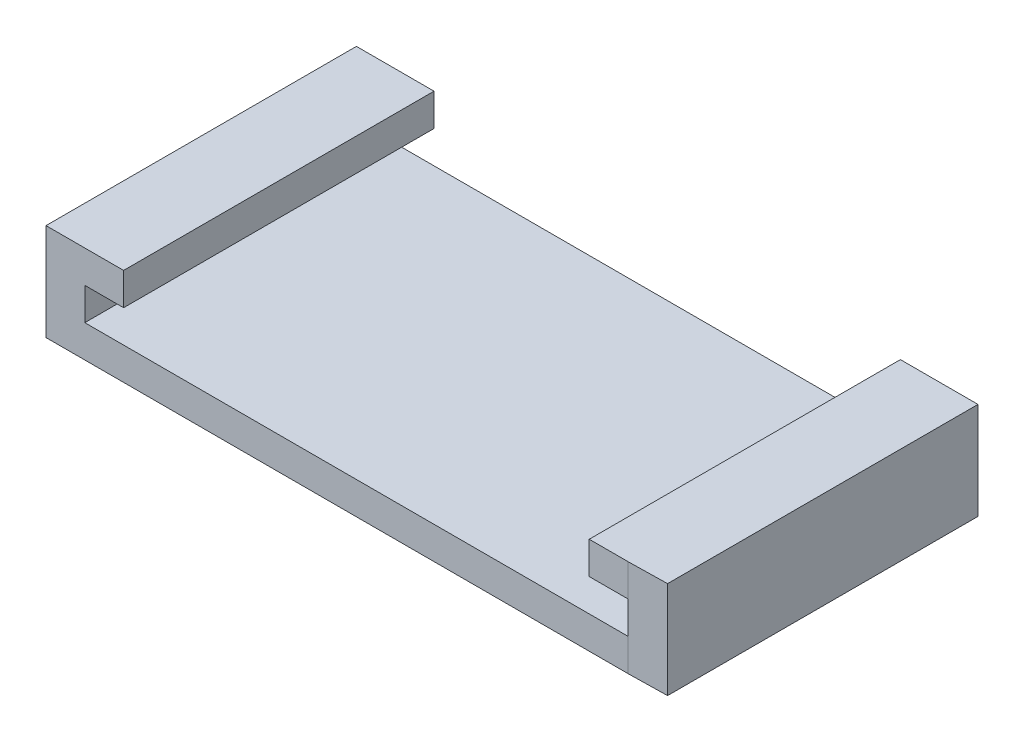
ISO-10303-21;
HEADER;
FILE_DESCRIPTION(('STEP AP214'),'2;1');
FILE_NAME('part.step','',(''),(''),'','','');
FILE_SCHEMA(('AUTOMOTIVE_DESIGN { 1 0 10303 214 1 1 1 1 }'));
ENDSEC;
DATA;
#1=APPLICATION_CONTEXT('core data for automotive mechanical design processes');
#2=APPLICATION_PROTOCOL_DEFINITION('international standard','automotive_design',2000,#1);
#3=PRODUCT_CONTEXT('',#1,'mechanical');
#4=PRODUCT('Part','Part','',(#3));
#5=PRODUCT_RELATED_PRODUCT_CATEGORY('part','',(#4));
#6=PRODUCT_DEFINITION_FORMATION('','',#4);
#7=PRODUCT_DEFINITION_CONTEXT('part definition',#1,'design');
#8=PRODUCT_DEFINITION('design','',#6,#7);
#9=PRODUCT_DEFINITION_SHAPE('','',#8);
#10=(LENGTH_UNIT() NAMED_UNIT(*) SI_UNIT(.MILLI.,.METRE.));
#11=(NAMED_UNIT(*) PLANE_ANGLE_UNIT() SI_UNIT($,.RADIAN.));
#12=(NAMED_UNIT(*) SI_UNIT($,.STERADIAN.) SOLID_ANGLE_UNIT());
#13=UNCERTAINTY_MEASURE_WITH_UNIT(LENGTH_MEASURE(1.E-05),#10,'distance_accuracy_value','');
#14=(GEOMETRIC_REPRESENTATION_CONTEXT(3) GLOBAL_UNCERTAINTY_ASSIGNED_CONTEXT((#13)) GLOBAL_UNIT_ASSIGNED_CONTEXT((#10,
#11,#12)) REPRESENTATION_CONTEXT('',''));
#15=CARTESIAN_POINT('',(0.,0.,0.));
#16=DIRECTION('',(0.,0.,1.));
#17=DIRECTION('',(1.,0.,0.));
#18=AXIS2_PLACEMENT_3D('',#15,#16,#17);
#19=CARTESIAN_POINT('',(0.,7.5,0.));
#20=DIRECTION('',(1.,0.,0.));
#21=DIRECTION('',(0.,0.,-1.));
#22=AXIS2_PLACEMENT_3D('',#19,#20,#21);
#23=PLANE('',#22);
#24=DIRECTION('',(0.,-1.,0.));
#25=VECTOR('',#24,1.);
#26=CARTESIAN_POINT('',(0.,7.5,-24.));
#27=LINE('',#26,#25);
#28=CARTESIAN_POINT('',(0.,5.,-24.));
#29=VERTEX_POINT('',#28);
#30=CARTESIAN_POINT('',(0.,2.5,-24.));
#31=VERTEX_POINT('',#30);
#32=EDGE_CURVE('E47',#29,#31,#27,.T.);
#33=ORIENTED_EDGE('',*,*,#32,.F.);
#34=DIRECTION('',(0.,0.,-1.));
#35=VECTOR('',#34,1.);
#36=CARTESIAN_POINT('',(0.,5.,0.));
#37=LINE('',#36,#35);
#38=CARTESIAN_POINT('',(0.,5.,0.));
#39=VERTEX_POINT('',#38);
#40=EDGE_CURVE('E51',#39,#29,#37,.T.);
#41=ORIENTED_EDGE('',*,*,#40,.F.);
#42=DIRECTION('',(0.,-1.,0.));
#43=VECTOR('',#42,1.);
#44=CARTESIAN_POINT('',(0.,7.5,0.));
#45=LINE('',#44,#43);
#46=CARTESIAN_POINT('',(0.,2.5,0.));
#47=VERTEX_POINT('',#46);
#48=EDGE_CURVE('E219',#39,#47,#45,.T.);
#49=ORIENTED_EDGE('',*,*,#48,.T.);
#50=DIRECTION('',(0.,0.,-1.));
#51=VECTOR('',#50,1.);
#52=CARTESIAN_POINT('',(0.,2.5,0.));
#53=LINE('',#52,#51);
#54=EDGE_CURVE('E240',#47,#31,#53,.T.);
#55=ORIENTED_EDGE('',*,*,#54,.T.);
#56=EDGE_LOOP('',(#33,#41,#49,#55));
#57=FACE_BOUND('',#56,.T.);
#58=ADVANCED_FACE('F32',(#57),#23,.T.);
#59=CARTESIAN_POINT('',(42.,7.5,0.));
#60=DIRECTION('',(-1.,0.,0.));
#61=DIRECTION('',(0.,0.,1.));
#62=AXIS2_PLACEMENT_3D('',#59,#60,#61);
#63=PLANE('',#62);
#64=DIRECTION('',(0.,-1.,0.));
#65=VECTOR('',#64,1.);
#66=CARTESIAN_POINT('',(42.,7.5,0.));
#67=LINE('',#66,#65);
#68=CARTESIAN_POINT('',(42.,5.,0.));
#69=VERTEX_POINT('',#68);
#70=CARTESIAN_POINT('',(42.,2.5,0.));
#71=VERTEX_POINT('',#70);
#72=EDGE_CURVE('E210',#69,#71,#67,.T.);
#73=ORIENTED_EDGE('',*,*,#72,.F.);
#74=DIRECTION('',(0.,0.00155997809462607,0.999998783233432));
#75=VECTOR('',#74,1.);
#76=CARTESIAN_POINT('',(42.,4.96247278638862,-24.0562146858351));
#77=LINE('',#76,#75);
#78=CARTESIAN_POINT('',(42.,4.96247278638862,-24.0562146858351));
#79=VERTEX_POINT('',#78);
#80=EDGE_CURVE('E165',#79,#69,#77,.T.);
#81=ORIENTED_EDGE('',*,*,#80,.F.);
#82=DIRECTION('',(0.,-1.,0.));
#83=VECTOR('',#82,1.);
#84=CARTESIAN_POINT('',(42.,7.5,-24.0562146858351));
#85=LINE('',#84,#83);
#86=CARTESIAN_POINT('',(42.,0.,-24.0562146858351));
#87=VERTEX_POINT('',#86);
#88=EDGE_CURVE('E196',#79,#87,#85,.T.);
#89=ORIENTED_EDGE('',*,*,#88,.T.);
#90=DIRECTION('',(0.,0.,-1.));
#91=VECTOR('',#90,1.);
#92=CARTESIAN_POINT('',(42.,0.,0.));
#93=LINE('',#92,#91);
#94=CARTESIAN_POINT('',(42.,0.,-24.));
#95=VERTEX_POINT('',#94);
#96=EDGE_CURVE('E186',#95,#87,#93,.T.);
#97=ORIENTED_EDGE('',*,*,#96,.F.);
#98=DIRECTION('',(0.,-1.,0.));
#99=VECTOR('',#98,1.);
#100=CARTESIAN_POINT('',(42.,2.5,-24.));
#101=LINE('',#100,#99);
#102=CARTESIAN_POINT('',(42.,2.5,-24.));
#103=VERTEX_POINT('',#102);
#104=EDGE_CURVE('E40',#103,#95,#101,.T.);
#105=ORIENTED_EDGE('',*,*,#104,.F.);
#106=DIRECTION('',(0.,0.,-1.));
#107=VECTOR('',#106,1.);
#108=CARTESIAN_POINT('',(42.,2.5,0.));
#109=LINE('',#108,#107);
#110=EDGE_CURVE('E233',#71,#103,#109,.T.);
#111=ORIENTED_EDGE('',*,*,#110,.F.);
#112=EDGE_LOOP('',(#73,#81,#89,#97,#105,#111));
#113=FACE_BOUND('',#112,.T.);
#114=ADVANCED_FACE('F271',(#113),#63,.T.);
#115=CARTESIAN_POINT('',(0.,2.5,0.));
#116=DIRECTION('',(0.,0.,-1.));
#117=DIRECTION('',(-1.,0.,0.));
#118=AXIS2_PLACEMENT_3D('',#115,#116,#117);
#119=PLANE('',#118);
#120=DIRECTION('',(1.,0.,0.));
#121=VECTOR('',#120,1.);
#122=CARTESIAN_POINT('',(0.,0.,0.));
#123=LINE('',#122,#121);
#124=CARTESIAN_POINT('',(-3.,0.,0.));
#125=VERTEX_POINT('',#124);
#126=CARTESIAN_POINT('',(42.,0.,0.));
#127=VERTEX_POINT('',#126);
#128=EDGE_CURVE('E223',#125,#127,#123,.T.);
#129=ORIENTED_EDGE('',*,*,#128,.T.);
#130=DIRECTION('',(0.,-1.,0.));
#131=VECTOR('',#130,1.);
#132=CARTESIAN_POINT('',(42.,2.5,0.));
#133=LINE('',#132,#131);
#134=EDGE_CURVE('E11',#71,#127,#133,.T.);
#135=ORIENTED_EDGE('',*,*,#134,.F.);
#136=DIRECTION('',(1.,0.,0.));
#137=VECTOR('',#136,1.);
#138=CARTESIAN_POINT('',(0.,2.5,0.));
#139=LINE('',#138,#137);
#140=EDGE_CURVE('E230',#47,#71,#139,.T.);
#141=ORIENTED_EDGE('',*,*,#140,.F.);
#142=ORIENTED_EDGE('',*,*,#48,.F.);
#143=DIRECTION('',(-1.,0.,0.));
#144=VECTOR('',#143,1.);
#145=CARTESIAN_POINT('',(3.,5.,0.));
#146=LINE('',#145,#144);
#147=CARTESIAN_POINT('',(3.,5.,0.));
#148=VERTEX_POINT('',#147);
#149=EDGE_CURVE('E147',#148,#39,#146,.T.);
#150=ORIENTED_EDGE('',*,*,#149,.F.);
#151=DIRECTION('',(0.,-1.,0.));
#152=VECTOR('',#151,1.);
#153=CARTESIAN_POINT('',(3.,7.5,0.));
#154=LINE('',#153,#152);
#155=CARTESIAN_POINT('',(3.,7.5,0.));
#156=VERTEX_POINT('',#155);
#157=EDGE_CURVE('E144',#156,#148,#154,.T.);
#158=ORIENTED_EDGE('',*,*,#157,.F.);
#159=DIRECTION('',(-1.,0.,0.));
#160=VECTOR('',#159,1.);
#161=CARTESIAN_POINT('',(0.,7.5,0.));
#162=LINE('',#161,#160);
#163=CARTESIAN_POINT('',(-3.,7.5,0.));
#164=VERTEX_POINT('',#163);
#165=EDGE_CURVE('E131',#156,#164,#162,.T.);
#166=ORIENTED_EDGE('',*,*,#165,.T.);
#167=DIRECTION('',(0.,-1.,0.));
#168=VECTOR('',#167,1.);
#169=CARTESIAN_POINT('',(-3.,7.5,0.));
#170=LINE('',#169,#168);
#171=EDGE_CURVE('E227',#164,#125,#170,.T.);
#172=ORIENTED_EDGE('',*,*,#171,.T.);
#173=EDGE_LOOP('',(#129,#135,#141,#142,#150,#158,#166,#172));
#174=FACE_BOUND('',#173,.T.);
#175=ADVANCED_FACE('F34',(#174),#119,.F.);
#176=CARTESIAN_POINT('',(0.,2.5,-24.));
#177=DIRECTION('',(0.,0.,-1.));
#178=DIRECTION('',(-1.,0.,0.));
#179=AXIS2_PLACEMENT_3D('',#176,#177,#178);
#180=PLANE('',#179);
#181=DIRECTION('',(1.,0.,0.));
#182=VECTOR('',#181,1.);
#183=CARTESIAN_POINT('',(0.,0.,-24.));
#184=LINE('',#183,#182);
#185=CARTESIAN_POINT('',(-3.,0.,-24.));
#186=VERTEX_POINT('',#185);
#187=EDGE_CURVE('E234',#186,#95,#184,.T.);
#188=ORIENTED_EDGE('',*,*,#187,.F.);
#189=DIRECTION('',(0.,-1.,0.));
#190=VECTOR('',#189,1.);
#191=CARTESIAN_POINT('',(-3.,7.5,-24.));
#192=LINE('',#191,#190);
#193=CARTESIAN_POINT('',(-3.,7.5,-24.));
#194=VERTEX_POINT('',#193);
#195=EDGE_CURVE('E224',#194,#186,#192,.T.);
#196=ORIENTED_EDGE('',*,*,#195,.F.);
#197=DIRECTION('',(1.,0.,0.));
#198=VECTOR('',#197,1.);
#199=CARTESIAN_POINT('',(0.,7.5,-24.));
#200=LINE('',#199,#198);
#201=CARTESIAN_POINT('',(3.,7.5,-24.));
#202=VERTEX_POINT('',#201);
#203=EDGE_CURVE('E217',#194,#202,#200,.T.);
#204=ORIENTED_EDGE('',*,*,#203,.T.);
#205=DIRECTION('',(0.,1.,0.));
#206=VECTOR('',#205,1.);
#207=CARTESIAN_POINT('',(3.,5.,-24.));
#208=LINE('',#207,#206);
#209=CARTESIAN_POINT('',(3.,5.,-24.));
#210=VERTEX_POINT('',#209);
#211=EDGE_CURVE('E155',#210,#202,#208,.T.);
#212=ORIENTED_EDGE('',*,*,#211,.F.);
#213=DIRECTION('',(-1.,0.,0.));
#214=VECTOR('',#213,1.);
#215=CARTESIAN_POINT('',(3.,5.,-24.));
#216=LINE('',#215,#214);
#217=EDGE_CURVE('E160',#210,#29,#216,.T.);
#218=ORIENTED_EDGE('',*,*,#217,.T.);
#219=ORIENTED_EDGE('',*,*,#32,.T.);
#220=DIRECTION('',(1.,0.,0.));
#221=VECTOR('',#220,1.);
#222=CARTESIAN_POINT('',(0.,2.5,-24.));
#223=LINE('',#222,#221);
#224=EDGE_CURVE('E237',#31,#103,#223,.T.);
#225=ORIENTED_EDGE('',*,*,#224,.T.);
#226=ORIENTED_EDGE('',*,*,#104,.T.);
#227=EDGE_LOOP('',(#188,#196,#204,#212,#218,#219,#225,#226));
#228=FACE_BOUND('',#227,.T.);
#229=ADVANCED_FACE('F246',(#228),#180,.T.);
#230=CARTESIAN_POINT('',(0.,2.5,0.));
#231=DIRECTION('',(0.,1.,0.));
#232=DIRECTION('',(0.,0.,1.));
#233=AXIS2_PLACEMENT_3D('',#230,#231,#232);
#234=PLANE('',#233);
#235=ORIENTED_EDGE('',*,*,#140,.T.);
#236=ORIENTED_EDGE('',*,*,#110,.T.);
#237=ORIENTED_EDGE('',*,*,#224,.F.);
#238=ORIENTED_EDGE('',*,*,#54,.F.);
#239=EDGE_LOOP('',(#235,#236,#237,#238));
#240=FACE_BOUND('',#239,.T.);
#241=ADVANCED_FACE('F280',(#240),#234,.T.);
#242=CARTESIAN_POINT('',(0.,0.,0.));
#243=DIRECTION('',(0.,1.,0.));
#244=DIRECTION('',(0.,0.,1.));
#245=AXIS2_PLACEMENT_3D('',#242,#243,#244);
#246=PLANE('',#245);
#247=ORIENTED_EDGE('',*,*,#128,.F.);
#248=DIRECTION('',(0.,0.,-1.));
#249=VECTOR('',#248,1.);
#250=CARTESIAN_POINT('',(-3.,0.,0.));
#251=LINE('',#250,#249);
#252=EDGE_CURVE('E141',#125,#186,#251,.T.);
#253=ORIENTED_EDGE('',*,*,#252,.T.);
#254=ORIENTED_EDGE('',*,*,#187,.T.);
#255=ORIENTED_EDGE('',*,*,#96,.T.);
#256=DIRECTION('',(1.,0.,0.));
#257=VECTOR('',#256,1.);
#258=CARTESIAN_POINT('',(42.,0.,-24.0562146858351));
#259=LINE('',#258,#257);
#260=CARTESIAN_POINT('',(45.,0.,-24.0562146858351));
#261=VERTEX_POINT('',#260);
#262=EDGE_CURVE('E199',#87,#261,#259,.T.);
#263=ORIENTED_EDGE('',*,*,#262,.T.);
#264=DIRECTION('',(-2.19470069163947E-05,0.,0.999999999759164));
#265=VECTOR('',#264,1.);
#266=CARTESIAN_POINT('',(44.999473271834,0.,-0.0562146916151854));
#267=LINE('',#266,#265);
#268=CARTESIAN_POINT('',(44.999473271834,0.,-0.0562146916151854));
#269=VERTEX_POINT('',#268);
#270=EDGE_CURVE('E202',#261,#269,#267,.T.);
#271=ORIENTED_EDGE('',*,*,#270,.T.);
#272=DIRECTION('',(-0.99982442394467,0.,0.0187382305383951));
#273=VECTOR('',#272,1.);
#274=CARTESIAN_POINT('',(42.,0.,0.));
#275=LINE('',#274,#273);
#276=EDGE_CURVE('E191',#269,#127,#275,.T.);
#277=ORIENTED_EDGE('',*,*,#276,.T.);
#278=EDGE_LOOP('',(#247,#253,#254,#255,#263,#271,#277));
#279=FACE_BOUND('',#278,.T.);
#280=ADVANCED_FACE('F251',(#279),#246,.F.);
#281=CARTESIAN_POINT('',(-3.,7.5,0.));
#282=DIRECTION('',(-1.,0.,0.));
#283=DIRECTION('',(0.,0.,1.));
#284=AXIS2_PLACEMENT_3D('',#281,#282,#283);
#285=PLANE('',#284);
#286=ORIENTED_EDGE('',*,*,#252,.F.);
#287=ORIENTED_EDGE('',*,*,#171,.F.);
#288=DIRECTION('',(0.,0.,-1.));
#289=VECTOR('',#288,1.);
#290=CARTESIAN_POINT('',(-3.,7.5,0.));
#291=LINE('',#290,#289);
#292=EDGE_CURVE('E138',#164,#194,#291,.T.);
#293=ORIENTED_EDGE('',*,*,#292,.T.);
#294=ORIENTED_EDGE('',*,*,#195,.T.);
#295=EDGE_LOOP('',(#286,#287,#293,#294));
#296=FACE_BOUND('',#295,.T.);
#297=ADVANCED_FACE('F255',(#296),#285,.T.);
#298=CARTESIAN_POINT('',(0.,7.5,0.));
#299=DIRECTION('',(0.,1.,0.));
#300=DIRECTION('',(0.,0.,1.));
#301=AXIS2_PLACEMENT_3D('',#298,#299,#300);
#302=PLANE('',#301);
#303=ORIENTED_EDGE('',*,*,#165,.F.);
#304=DIRECTION('',(0.,0.,1.));
#305=VECTOR('',#304,1.);
#306=CARTESIAN_POINT('',(3.,7.5,-24.));
#307=LINE('',#306,#305);
#308=EDGE_CURVE('E136',#202,#156,#307,.T.);
#309=ORIENTED_EDGE('',*,*,#308,.F.);
#310=ORIENTED_EDGE('',*,*,#203,.F.);
#311=ORIENTED_EDGE('',*,*,#292,.F.);
#312=EDGE_LOOP('',(#303,#309,#310,#311));
#313=FACE_BOUND('',#312,.T.);
#314=ADVANCED_FACE('F133',(#313),#302,.T.);
#315=CARTESIAN_POINT('',(42.,7.5,0.));
#316=DIRECTION('',(0.0187382305383951,0.,0.999824423944669));
#317=DIRECTION('',(0.99982442394467,0.,-0.0187382305383951));
#318=AXIS2_PLACEMENT_3D('',#315,#316,#317);
#319=PLANE('',#318);
#320=ORIENTED_EDGE('',*,*,#276,.F.);
#321=DIRECTION('',(0.,-1.,0.));
#322=VECTOR('',#321,1.);
#323=CARTESIAN_POINT('',(44.999473271834,7.5,-0.0562146916151854));
#324=LINE('',#323,#322);
#325=CARTESIAN_POINT('',(44.999473271834,7.5,-0.0562146916151854));
#326=VERTEX_POINT('',#325);
#327=EDGE_CURVE('E211',#326,#269,#324,.T.);
#328=ORIENTED_EDGE('',*,*,#327,.F.);
#329=DIRECTION('',(-0.99982442394467,0.,0.0187382305383951));
#330=VECTOR('',#329,1.);
#331=CARTESIAN_POINT('',(42.,7.5,0.));
#332=LINE('',#331,#330);
#333=CARTESIAN_POINT('',(42.,7.5,0.));
#334=VERTEX_POINT('',#333);
#335=EDGE_CURVE('E194',#326,#334,#332,.T.);
#336=ORIENTED_EDGE('',*,*,#335,.T.);
#337=EDGE_CURVE('E207',#334,#69,#67,.T.);
#338=ORIENTED_EDGE('',*,*,#337,.T.);
#339=ORIENTED_EDGE('',*,*,#72,.T.);
#340=ORIENTED_EDGE('',*,*,#134,.T.);
#341=EDGE_LOOP('',(#320,#328,#336,#338,#339,#340));
#342=FACE_BOUND('',#341,.T.);
#343=ADVANCED_FACE('F308',(#342),#319,.T.);
#344=CARTESIAN_POINT('',(44.999473271834,7.5,-0.0562146916151854));
#345=DIRECTION('',(0.999999999759164,0.,2.19470069163947E-05));
#346=DIRECTION('',(2.19470069163947E-05,0.,-0.999999999759164));
#347=AXIS2_PLACEMENT_3D('',#344,#345,#346);
#348=PLANE('',#347);
#349=ORIENTED_EDGE('',*,*,#270,.F.);
#350=DIRECTION('',(0.,-1.,0.));
#351=VECTOR('',#350,1.);
#352=CARTESIAN_POINT('',(45.,7.5,-24.0562146858351));
#353=LINE('',#352,#351);
#354=CARTESIAN_POINT('',(45.,7.5,-24.0562146858351));
#355=VERTEX_POINT('',#354);
#356=EDGE_CURVE('E213',#355,#261,#353,.T.);
#357=ORIENTED_EDGE('',*,*,#356,.F.);
#358=DIRECTION('',(-2.19470069163947E-05,0.,0.999999999759164));
#359=VECTOR('',#358,1.);
#360=CARTESIAN_POINT('',(44.999473271834,7.5,-0.0562146916151854));
#361=LINE('',#360,#359);
#362=EDGE_CURVE('E190',#355,#326,#361,.T.);
#363=ORIENTED_EDGE('',*,*,#362,.T.);
#364=ORIENTED_EDGE('',*,*,#327,.T.);
#365=EDGE_LOOP('',(#349,#357,#363,#364));
#366=FACE_BOUND('',#365,.T.);
#367=ADVANCED_FACE('F303',(#366),#348,.T.);
#368=CARTESIAN_POINT('',(42.,7.5,-24.0562146858351));
#369=DIRECTION('',(0.,0.,-1.));
#370=DIRECTION('',(-1.,0.,0.));
#371=AXIS2_PLACEMENT_3D('',#368,#369,#370);
#372=PLANE('',#371);
#373=ORIENTED_EDGE('',*,*,#262,.F.);
#374=ORIENTED_EDGE('',*,*,#88,.F.);
#375=DIRECTION('',(1.,0.,0.));
#376=VECTOR('',#375,1.);
#377=CARTESIAN_POINT('',(39.,4.96247278638862,-24.0562146858351));
#378=LINE('',#377,#376);
#379=CARTESIAN_POINT('',(39.,4.96247278638862,-24.0562146858351));
#380=VERTEX_POINT('',#379);
#381=EDGE_CURVE('E183',#380,#79,#378,.T.);
#382=ORIENTED_EDGE('',*,*,#381,.F.);
#383=DIRECTION('',(0.,-1.,0.));
#384=VECTOR('',#383,1.);
#385=CARTESIAN_POINT('',(39.,7.5,-24.0562146858351));
#386=LINE('',#385,#384);
#387=CARTESIAN_POINT('',(39.,7.5,-24.0562146858351));
#388=VERTEX_POINT('',#387);
#389=EDGE_CURVE('E169',#388,#380,#386,.T.);
#390=ORIENTED_EDGE('',*,*,#389,.F.);
#391=DIRECTION('',(1.,0.,0.));
#392=VECTOR('',#391,1.);
#393=CARTESIAN_POINT('',(42.,7.5,-24.0562146858351));
#394=LINE('',#393,#392);
#395=EDGE_CURVE('E187',#388,#355,#394,.T.);
#396=ORIENTED_EDGE('',*,*,#395,.T.);
#397=ORIENTED_EDGE('',*,*,#356,.T.);
#398=EDGE_LOOP('',(#373,#374,#382,#390,#396,#397));
#399=FACE_BOUND('',#398,.T.);
#400=ADVANCED_FACE('F320',(#399),#372,.T.);
#401=CARTESIAN_POINT('',(0.,7.5,0.));
#402=DIRECTION('',(0.,-1.,0.));
#403=DIRECTION('',(0.,0.,-1.));
#404=AXIS2_PLACEMENT_3D('',#401,#402,#403);
#405=PLANE('',#404);
#406=ORIENTED_EDGE('',*,*,#395,.F.);
#407=DIRECTION('',(0.,0.,-1.));
#408=VECTOR('',#407,1.);
#409=CARTESIAN_POINT('',(39.,7.5,0.));
#410=LINE('',#409,#408);
#411=CARTESIAN_POINT('',(39.,7.5,0.));
#412=VERTEX_POINT('',#411);
#413=EDGE_CURVE('E166',#412,#388,#410,.T.);
#414=ORIENTED_EDGE('',*,*,#413,.F.);
#415=DIRECTION('',(1.,0.,0.));
#416=VECTOR('',#415,1.);
#417=CARTESIAN_POINT('',(39.,7.5,0.));
#418=LINE('',#417,#416);
#419=EDGE_CURVE('E175',#412,#334,#418,.T.);
#420=ORIENTED_EDGE('',*,*,#419,.T.);
#421=ORIENTED_EDGE('',*,*,#335,.F.);
#422=ORIENTED_EDGE('',*,*,#362,.F.);
#423=EDGE_LOOP('',(#406,#414,#420,#421,#422));
#424=FACE_BOUND('',#423,.T.);
#425=ADVANCED_FACE('F324',(#424),#405,.F.);
#426=CARTESIAN_POINT('',(39.,4.96247278638862,-24.0562146858351));
#427=DIRECTION('',(0.,0.999998783233432,-0.00155997809462607));
#428=DIRECTION('',(0.,0.00155997809462607,0.999998783233432));
#429=AXIS2_PLACEMENT_3D('',#426,#427,#428);
#430=PLANE('',#429);
#431=ORIENTED_EDGE('',*,*,#80,.T.);
#432=DIRECTION('',(1.,0.,0.));
#433=VECTOR('',#432,1.);
#434=CARTESIAN_POINT('',(39.,5.,0.));
#435=LINE('',#434,#433);
#436=CARTESIAN_POINT('',(39.,5.,0.));
#437=VERTEX_POINT('',#436);
#438=EDGE_CURVE('E180',#437,#69,#435,.T.);
#439=ORIENTED_EDGE('',*,*,#438,.F.);
#440=DIRECTION('',(0.,0.00155997809462607,0.999998783233432));
#441=VECTOR('',#440,1.);
#442=CARTESIAN_POINT('',(39.,4.96247278638862,-24.0562146858351));
#443=LINE('',#442,#441);
#444=EDGE_CURVE('E171',#380,#437,#443,.T.);
#445=ORIENTED_EDGE('',*,*,#444,.F.);
#446=ORIENTED_EDGE('',*,*,#381,.T.);
#447=EDGE_LOOP('',(#431,#439,#445,#446));
#448=FACE_BOUND('',#447,.T.);
#449=ADVANCED_FACE('F335',(#448),#430,.F.);
#450=CARTESIAN_POINT('',(39.,5.,0.));
#451=DIRECTION('',(0.,0.,-1.));
#452=DIRECTION('',(-1.,0.,0.));
#453=AXIS2_PLACEMENT_3D('',#450,#451,#452);
#454=PLANE('',#453);
#455=ORIENTED_EDGE('',*,*,#337,.F.);
#456=ORIENTED_EDGE('',*,*,#419,.F.);
#457=DIRECTION('',(0.,1.,0.));
#458=VECTOR('',#457,1.);
#459=CARTESIAN_POINT('',(39.,5.,0.));
#460=LINE('',#459,#458);
#461=EDGE_CURVE('E173',#437,#412,#460,.T.);
#462=ORIENTED_EDGE('',*,*,#461,.F.);
#463=ORIENTED_EDGE('',*,*,#438,.T.);
#464=EDGE_LOOP('',(#455,#456,#462,#463));
#465=FACE_BOUND('',#464,.T.);
#466=ADVANCED_FACE('F267',(#465),#454,.F.);
#467=CARTESIAN_POINT('',(39.,0.,0.));
#468=DIRECTION('',(-1.,0.,0.));
#469=DIRECTION('',(0.,0.,1.));
#470=AXIS2_PLACEMENT_3D('',#467,#468,#469);
#471=PLANE('',#470);
#472=ORIENTED_EDGE('',*,*,#413,.T.);
#473=ORIENTED_EDGE('',*,*,#389,.T.);
#474=ORIENTED_EDGE('',*,*,#444,.T.);
#475=ORIENTED_EDGE('',*,*,#461,.T.);
#476=EDGE_LOOP('',(#472,#473,#474,#475));
#477=FACE_BOUND('',#476,.T.);
#478=ADVANCED_FACE('F260',(#477),#471,.T.);
#479=CARTESIAN_POINT('',(3.,5.,0.));
#480=DIRECTION('',(0.,1.,0.));
#481=DIRECTION('',(0.,0.,1.));
#482=AXIS2_PLACEMENT_3D('',#479,#480,#481);
#483=PLANE('',#482);
#484=ORIENTED_EDGE('',*,*,#40,.T.);
#485=ORIENTED_EDGE('',*,*,#217,.F.);
#486=DIRECTION('',(0.,0.,-1.));
#487=VECTOR('',#486,1.);
#488=CARTESIAN_POINT('',(3.,5.,0.));
#489=LINE('',#488,#487);
#490=EDGE_CURVE('E150',#148,#210,#489,.T.);
#491=ORIENTED_EDGE('',*,*,#490,.F.);
#492=ORIENTED_EDGE('',*,*,#149,.T.);
#493=EDGE_LOOP('',(#484,#485,#491,#492));
#494=FACE_BOUND('',#493,.T.);
#495=ADVANCED_FACE('F258',(#494),#483,.F.);
#496=CARTESIAN_POINT('',(3.,0.,0.));
#497=DIRECTION('',(1.,0.,0.));
#498=DIRECTION('',(0.,0.,-1.));
#499=AXIS2_PLACEMENT_3D('',#496,#497,#498);
#500=PLANE('',#499);
#501=ORIENTED_EDGE('',*,*,#308,.T.);
#502=ORIENTED_EDGE('',*,*,#157,.T.);
#503=ORIENTED_EDGE('',*,*,#490,.T.);
#504=ORIENTED_EDGE('',*,*,#211,.T.);
#505=EDGE_LOOP('',(#501,#502,#503,#504));
#506=FACE_BOUND('',#505,.T.);
#507=ADVANCED_FACE('F153',(#506),#500,.T.);
#508=CLOSED_SHELL('',(#58,#114,#175,#229,#241,#280,#297,#314,#343,#367,#400,#425,#449,#466,#478,
#495,#507));
#509=MANIFOLD_SOLID_BREP('B2',#508);
#510=ADVANCED_BREP_SHAPE_REPRESENTATION('',(#18,#509),#14);
#511=SHAPE_DEFINITION_REPRESENTATION(#9,#510);
ENDSEC;
END-ISO-10303-21;
